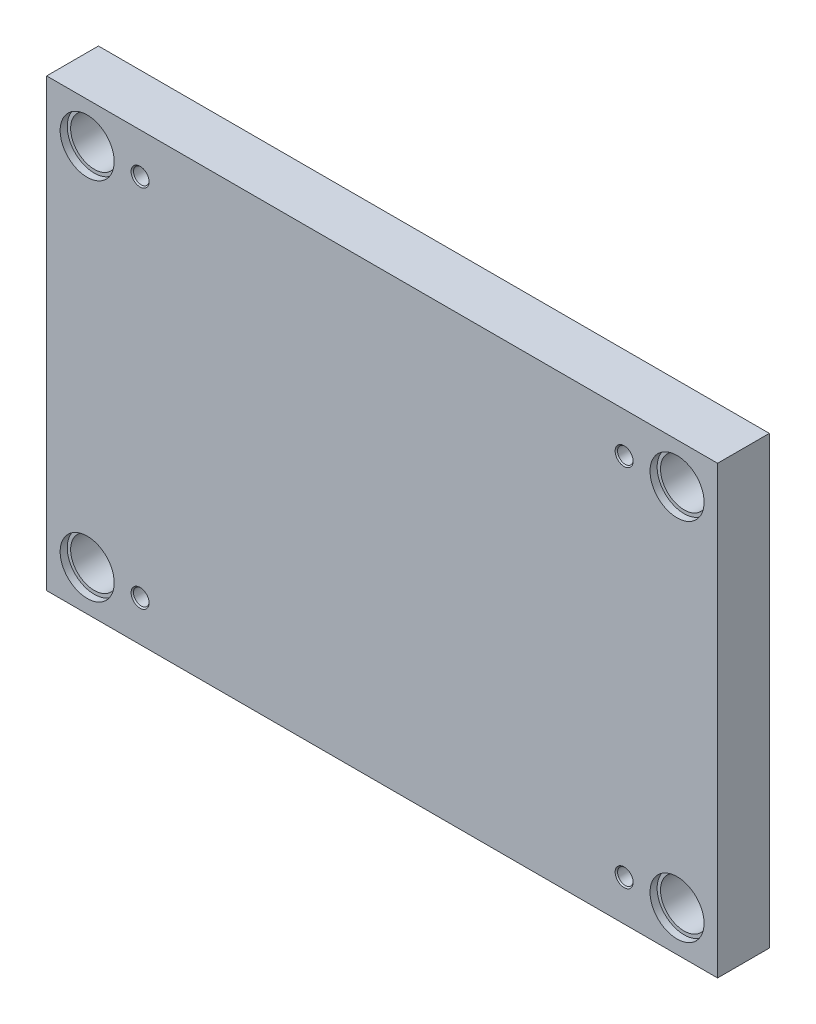
ISO-10303-21;
HEADER;
FILE_DESCRIPTION(('STEP AP214'),'2;1');
FILE_NAME('part.step','',(''),(''),'','','');
FILE_SCHEMA(('AUTOMOTIVE_DESIGN { 1 0 10303 214 1 1 1 1 }'));
ENDSEC;
DATA;
#1=APPLICATION_CONTEXT('core data for automotive mechanical design processes');
#2=APPLICATION_PROTOCOL_DEFINITION('international standard','automotive_design',2000,#1);
#3=PRODUCT_CONTEXT('',#1,'mechanical');
#4=PRODUCT('Part','Part','',(#3));
#5=PRODUCT_RELATED_PRODUCT_CATEGORY('part','',(#4));
#6=PRODUCT_DEFINITION_FORMATION('','',#4);
#7=PRODUCT_DEFINITION_CONTEXT('part definition',#1,'design');
#8=PRODUCT_DEFINITION('design','',#6,#7);
#9=PRODUCT_DEFINITION_SHAPE('','',#8);
#10=(LENGTH_UNIT() NAMED_UNIT(*) SI_UNIT(.MILLI.,.METRE.));
#11=(NAMED_UNIT(*) PLANE_ANGLE_UNIT() SI_UNIT($,.RADIAN.));
#12=(NAMED_UNIT(*) SI_UNIT($,.STERADIAN.) SOLID_ANGLE_UNIT());
#13=UNCERTAINTY_MEASURE_WITH_UNIT(LENGTH_MEASURE(1.E-05),#10,'distance_accuracy_value','');
#14=(GEOMETRIC_REPRESENTATION_CONTEXT(3) GLOBAL_UNCERTAINTY_ASSIGNED_CONTEXT((#13)) GLOBAL_UNIT_ASSIGNED_CONTEXT((#10,
#11,#12)) REPRESENTATION_CONTEXT('',''));
#15=CARTESIAN_POINT('',(0.,0.,0.));
#16=DIRECTION('',(0.,0.,1.));
#17=DIRECTION('',(1.,0.,0.));
#18=AXIS2_PLACEMENT_3D('',#15,#16,#17);
#19=CARTESIAN_POINT('',(0.,0.,46.));
#20=DIRECTION('',(0.,0.,1.));
#21=DIRECTION('',(1.,0.,0.));
#22=AXIS2_PLACEMENT_3D('',#19,#20,#21);
#23=PLANE('',#22);
#24=CARTESIAN_POINT('',(215.,162.,46.));
#25=DIRECTION('',(0.,0.,1.));
#26=DIRECTION('',(1.,0.,0.));
#27=AXIS2_PLACEMENT_3D('',#24,#25,#26);
#28=CIRCLE('',#27,8.00000000000001);
#29=CARTESIAN_POINT('',(223.,162.,46.));
#30=VERTEX_POINT('',#29);
#31=EDGE_CURVE('E125',#30,#30,#28,.T.);
#32=ORIENTED_EDGE('',*,*,#31,.F.);
#33=EDGE_LOOP('',(#32));
#34=FACE_BOUND('',#33,.T.);
#35=CARTESIAN_POINT('',(-215.,162.,46.));
#36=DIRECTION('',(0.,0.,1.));
#37=DIRECTION('',(1.,0.,0.));
#38=AXIS2_PLACEMENT_3D('',#35,#36,#37);
#39=CIRCLE('',#38,8.00000000000001);
#40=CARTESIAN_POINT('',(-207.,162.,46.));
#41=VERTEX_POINT('',#40);
#42=EDGE_CURVE('E143',#41,#41,#39,.T.);
#43=ORIENTED_EDGE('',*,*,#42,.F.);
#44=EDGE_LOOP('',(#43));
#45=FACE_BOUND('',#44,.T.);
#46=CARTESIAN_POINT('',(262.,-162.,46.));
#47=DIRECTION('',(0.,0.,1.));
#48=DIRECTION('',(1.,0.,0.));
#49=AXIS2_PLACEMENT_3D('',#46,#47,#48);
#50=CIRCLE('',#49,24.);
#51=CARTESIAN_POINT('',(286.,-162.,46.));
#52=VERTEX_POINT('',#51);
#53=EDGE_CURVE('E146',#52,#52,#50,.T.);
#54=ORIENTED_EDGE('',*,*,#53,.F.);
#55=EDGE_LOOP('',(#54));
#56=FACE_BOUND('',#55,.T.);
#57=CARTESIAN_POINT('',(-262.,-162.,46.));
#58=DIRECTION('',(0.,0.,1.));
#59=DIRECTION('',(1.,0.,0.));
#60=AXIS2_PLACEMENT_3D('',#57,#58,#59);
#61=CIRCLE('',#60,24.);
#62=CARTESIAN_POINT('',(-238.,-162.,46.));
#63=VERTEX_POINT('',#62);
#64=EDGE_CURVE('E156',#63,#63,#61,.T.);
#65=ORIENTED_EDGE('',*,*,#64,.F.);
#66=EDGE_LOOP('',(#65));
#67=FACE_BOUND('',#66,.T.);
#68=CARTESIAN_POINT('',(262.,162.,46.));
#69=DIRECTION('',(0.,0.,1.));
#70=DIRECTION('',(1.,0.,0.));
#71=AXIS2_PLACEMENT_3D('',#68,#69,#70);
#72=CIRCLE('',#71,24.);
#73=CARTESIAN_POINT('',(286.,162.,46.));
#74=VERTEX_POINT('',#73);
#75=EDGE_CURVE('E163',#74,#74,#72,.T.);
#76=ORIENTED_EDGE('',*,*,#75,.F.);
#77=EDGE_LOOP('',(#76));
#78=FACE_BOUND('',#77,.T.);
#79=CARTESIAN_POINT('',(-262.,162.,46.));
#80=DIRECTION('',(0.,0.,1.));
#81=DIRECTION('',(1.,0.,0.));
#82=AXIS2_PLACEMENT_3D('',#79,#80,#81);
#83=CIRCLE('',#82,24.);
#84=CARTESIAN_POINT('',(-238.,162.,46.));
#85=VERTEX_POINT('',#84);
#86=EDGE_CURVE('E170',#85,#85,#83,.T.);
#87=ORIENTED_EDGE('',*,*,#86,.F.);
#88=EDGE_LOOP('',(#87));
#89=FACE_BOUND('',#88,.T.);
#90=DIRECTION('',(0.,-1.,0.));
#91=VECTOR('',#90,1.);
#92=CARTESIAN_POINT('',(-298.,198.,46.));
#93=LINE('',#92,#91);
#94=CARTESIAN_POINT('',(-298.,198.,46.));
#95=VERTEX_POINT('',#94);
#96=CARTESIAN_POINT('',(-298.,-198.,46.));
#97=VERTEX_POINT('',#96);
#98=EDGE_CURVE('E186',#95,#97,#93,.T.);
#99=ORIENTED_EDGE('',*,*,#98,.T.);
#100=DIRECTION('',(1.,0.,0.));
#101=VECTOR('',#100,1.);
#102=CARTESIAN_POINT('',(-298.,-198.,46.));
#103=LINE('',#102,#101);
#104=CARTESIAN_POINT('',(298.,-198.,46.));
#105=VERTEX_POINT('',#104);
#106=EDGE_CURVE('E89',#97,#105,#103,.T.);
#107=ORIENTED_EDGE('',*,*,#106,.T.);
#108=DIRECTION('',(0.,1.,0.));
#109=VECTOR('',#108,1.);
#110=CARTESIAN_POINT('',(298.,-198.,46.));
#111=LINE('',#110,#109);
#112=CARTESIAN_POINT('',(298.,198.,46.));
#113=VERTEX_POINT('',#112);
#114=EDGE_CURVE('E189',#105,#113,#111,.T.);
#115=ORIENTED_EDGE('',*,*,#114,.T.);
#116=DIRECTION('',(-1.,0.,0.));
#117=VECTOR('',#116,1.);
#118=CARTESIAN_POINT('',(298.,198.,46.));
#119=LINE('',#118,#117);
#120=EDGE_CURVE('E58',#113,#95,#119,.T.);
#121=ORIENTED_EDGE('',*,*,#120,.T.);
#122=EDGE_LOOP('',(#99,#107,#115,#121));
#123=FACE_BOUND('',#122,.T.);
#124=CARTESIAN_POINT('',(-215.,-162.,46.));
#125=DIRECTION('',(0.,0.,-1.));
#126=DIRECTION('',(-1.,0.,0.));
#127=AXIS2_PLACEMENT_3D('',#124,#125,#126);
#128=CIRCLE('',#127,8.00000000000001);
#129=CARTESIAN_POINT('',(-223.,-162.,46.));
#130=VERTEX_POINT('',#129);
#131=EDGE_CURVE('E134',#130,#130,#128,.T.);
#132=ORIENTED_EDGE('',*,*,#131,.T.);
#133=EDGE_LOOP('',(#132));
#134=FACE_BOUND('',#133,.T.);
#135=CARTESIAN_POINT('',(215.,-162.,46.));
#136=DIRECTION('',(0.,0.,-1.));
#137=DIRECTION('',(-1.,0.,0.));
#138=AXIS2_PLACEMENT_3D('',#135,#136,#137);
#139=CIRCLE('',#138,8.00000000000001);
#140=CARTESIAN_POINT('',(207.,-162.,46.));
#141=VERTEX_POINT('',#140);
#142=EDGE_CURVE('E114',#141,#141,#139,.T.);
#143=ORIENTED_EDGE('',*,*,#142,.T.);
#144=EDGE_LOOP('',(#143));
#145=FACE_BOUND('',#144,.T.);
#146=ADVANCED_FACE('F39',(#34,#45,#56,#67,#78,#89,#123,#134,#145),#23,.T.);
#147=CARTESIAN_POINT('',(262.,-162.,0.));
#148=DIRECTION('',(0.,0.,1.));
#149=DIRECTION('',(1.,0.,0.));
#150=AXIS2_PLACEMENT_3D('',#147,#148,#149);
#151=CYLINDRICAL_SURFACE('',#150,21.);
#152=CARTESIAN_POINT('',(262.,-162.,0.));
#153=DIRECTION('',(0.,0.,1.));
#154=DIRECTION('',(1.,0.,0.));
#155=AXIS2_PLACEMENT_3D('',#152,#153,#154);
#156=CIRCLE('',#155,21.);
#157=CARTESIAN_POINT('',(283.,-162.,0.));
#158=VERTEX_POINT('',#157);
#159=EDGE_CURVE('E179',#158,#158,#156,.T.);
#160=ORIENTED_EDGE('',*,*,#159,.F.);
#161=EDGE_LOOP('',(#160));
#162=FACE_BOUND('',#161,.T.);
#163=CARTESIAN_POINT('',(262.,-162.,39.7));
#164=DIRECTION('',(0.,0.,1.));
#165=DIRECTION('',(1.,0.,0.));
#166=AXIS2_PLACEMENT_3D('',#163,#164,#165);
#167=CIRCLE('',#166,21.);
#168=CARTESIAN_POINT('',(283.,-162.,39.7));
#169=VERTEX_POINT('',#168);
#170=EDGE_CURVE('E43',#169,#169,#167,.F.);
#171=ORIENTED_EDGE('',*,*,#170,.F.);
#172=EDGE_LOOP('',(#171));
#173=FACE_BOUND('',#172,.T.);
#174=ADVANCED_FACE('F214',(#162,#173),#151,.F.);
#175=CARTESIAN_POINT('',(-262.,-162.,0.));
#176=DIRECTION('',(0.,0.,1.));
#177=DIRECTION('',(1.,0.,0.));
#178=AXIS2_PLACEMENT_3D('',#175,#176,#177);
#179=CYLINDRICAL_SURFACE('',#178,21.);
#180=CARTESIAN_POINT('',(-262.,-162.,0.));
#181=DIRECTION('',(0.,0.,1.));
#182=DIRECTION('',(1.,0.,0.));
#183=AXIS2_PLACEMENT_3D('',#180,#181,#182);
#184=CIRCLE('',#183,21.);
#185=CARTESIAN_POINT('',(-241.,-162.,0.));
#186=VERTEX_POINT('',#185);
#187=EDGE_CURVE('E176',#186,#186,#184,.T.);
#188=ORIENTED_EDGE('',*,*,#187,.F.);
#189=EDGE_LOOP('',(#188));
#190=FACE_BOUND('',#189,.T.);
#191=CARTESIAN_POINT('',(-262.,-162.,39.7));
#192=DIRECTION('',(0.,0.,1.));
#193=DIRECTION('',(1.,0.,0.));
#194=AXIS2_PLACEMENT_3D('',#191,#192,#193);
#195=CIRCLE('',#194,21.);
#196=CARTESIAN_POINT('',(-241.,-162.,39.7));
#197=VERTEX_POINT('',#196);
#198=EDGE_CURVE('E155',#197,#197,#195,.F.);
#199=ORIENTED_EDGE('',*,*,#198,.F.);
#200=EDGE_LOOP('',(#199));
#201=FACE_BOUND('',#200,.T.);
#202=ADVANCED_FACE('F211',(#190,#201),#179,.F.);
#203=CARTESIAN_POINT('',(262.,162.,0.));
#204=DIRECTION('',(0.,0.,1.));
#205=DIRECTION('',(1.,0.,0.));
#206=AXIS2_PLACEMENT_3D('',#203,#204,#205);
#207=CYLINDRICAL_SURFACE('',#206,21.);
#208=CARTESIAN_POINT('',(262.,162.,0.));
#209=DIRECTION('',(0.,0.,1.));
#210=DIRECTION('',(1.,0.,0.));
#211=AXIS2_PLACEMENT_3D('',#208,#209,#210);
#212=CIRCLE('',#211,21.);
#213=CARTESIAN_POINT('',(283.,162.,0.));
#214=VERTEX_POINT('',#213);
#215=EDGE_CURVE('E182',#214,#214,#212,.T.);
#216=ORIENTED_EDGE('',*,*,#215,.F.);
#217=EDGE_LOOP('',(#216));
#218=FACE_BOUND('',#217,.T.);
#219=CARTESIAN_POINT('',(262.,162.,39.7));
#220=DIRECTION('',(0.,0.,1.));
#221=DIRECTION('',(1.,0.,0.));
#222=AXIS2_PLACEMENT_3D('',#219,#220,#221);
#223=CIRCLE('',#222,21.);
#224=CARTESIAN_POINT('',(283.,162.,39.7));
#225=VERTEX_POINT('',#224);
#226=EDGE_CURVE('E162',#225,#225,#223,.F.);
#227=ORIENTED_EDGE('',*,*,#226,.F.);
#228=EDGE_LOOP('',(#227));
#229=FACE_BOUND('',#228,.T.);
#230=ADVANCED_FACE('F213',(#218,#229),#207,.F.);
#231=CARTESIAN_POINT('',(-262.,162.,0.));
#232=DIRECTION('',(0.,0.,1.));
#233=DIRECTION('',(1.,0.,0.));
#234=AXIS2_PLACEMENT_3D('',#231,#232,#233);
#235=CYLINDRICAL_SURFACE('',#234,21.);
#236=CARTESIAN_POINT('',(-262.,162.,0.));
#237=DIRECTION('',(0.,0.,1.));
#238=DIRECTION('',(1.,0.,0.));
#239=AXIS2_PLACEMENT_3D('',#236,#237,#238);
#240=CIRCLE('',#239,21.);
#241=CARTESIAN_POINT('',(-241.,162.,0.));
#242=VERTEX_POINT('',#241);
#243=EDGE_CURVE('E173',#242,#242,#240,.T.);
#244=ORIENTED_EDGE('',*,*,#243,.F.);
#245=EDGE_LOOP('',(#244));
#246=FACE_BOUND('',#245,.T.);
#247=CARTESIAN_POINT('',(-262.,162.,39.7));
#248=DIRECTION('',(0.,0.,1.));
#249=DIRECTION('',(1.,0.,0.));
#250=AXIS2_PLACEMENT_3D('',#247,#248,#249);
#251=CIRCLE('',#250,21.);
#252=CARTESIAN_POINT('',(-241.,162.,39.7));
#253=VERTEX_POINT('',#252);
#254=EDGE_CURVE('E169',#253,#253,#251,.F.);
#255=ORIENTED_EDGE('',*,*,#254,.F.);
#256=EDGE_LOOP('',(#255));
#257=FACE_BOUND('',#256,.T.);
#258=ADVANCED_FACE('F221',(#246,#257),#235,.F.);
#259=CARTESIAN_POINT('',(-298.,198.,46.));
#260=DIRECTION('',(1.,0.,0.));
#261=DIRECTION('',(0.,0.,-1.));
#262=AXIS2_PLACEMENT_3D('',#259,#260,#261);
#263=PLANE('',#262);
#264=DIRECTION('',(0.,-1.,0.));
#265=VECTOR('',#264,1.);
#266=CARTESIAN_POINT('',(-298.,198.,0.));
#267=LINE('',#266,#265);
#268=CARTESIAN_POINT('',(-298.,198.,0.));
#269=VERTEX_POINT('',#268);
#270=CARTESIAN_POINT('',(-298.,-198.,0.));
#271=VERTEX_POINT('',#270);
#272=EDGE_CURVE('E185',#269,#271,#267,.T.);
#273=ORIENTED_EDGE('',*,*,#272,.T.);
#274=DIRECTION('',(0.,0.,-1.));
#275=VECTOR('',#274,1.);
#276=CARTESIAN_POINT('',(-298.,-198.,46.));
#277=LINE('',#276,#275);
#278=EDGE_CURVE('E11',#97,#271,#277,.T.);
#279=ORIENTED_EDGE('',*,*,#278,.F.);
#280=ORIENTED_EDGE('',*,*,#98,.F.);
#281=DIRECTION('',(0.,0.,-1.));
#282=VECTOR('',#281,1.);
#283=CARTESIAN_POINT('',(-298.,198.,46.));
#284=LINE('',#283,#282);
#285=EDGE_CURVE('E192',#95,#269,#284,.T.);
#286=ORIENTED_EDGE('',*,*,#285,.T.);
#287=EDGE_LOOP('',(#273,#279,#280,#286));
#288=FACE_BOUND('',#287,.T.);
#289=ADVANCED_FACE('F41',(#288),#263,.F.);
#290=CARTESIAN_POINT('',(-298.,-198.,46.));
#291=DIRECTION('',(0.,1.,0.));
#292=DIRECTION('',(0.,0.,1.));
#293=AXIS2_PLACEMENT_3D('',#290,#291,#292);
#294=PLANE('',#293);
#295=DIRECTION('',(1.,0.,0.));
#296=VECTOR('',#295,1.);
#297=CARTESIAN_POINT('',(-298.,-198.,0.));
#298=LINE('',#297,#296);
#299=CARTESIAN_POINT('',(298.,-198.,0.));
#300=VERTEX_POINT('',#299);
#301=EDGE_CURVE('E195',#271,#300,#298,.T.);
#302=ORIENTED_EDGE('',*,*,#301,.T.);
#303=DIRECTION('',(0.,0.,-1.));
#304=VECTOR('',#303,1.);
#305=CARTESIAN_POINT('',(298.,-198.,46.));
#306=LINE('',#305,#304);
#307=EDGE_CURVE('E49',#105,#300,#306,.T.);
#308=ORIENTED_EDGE('',*,*,#307,.F.);
#309=ORIENTED_EDGE('',*,*,#106,.F.);
#310=ORIENTED_EDGE('',*,*,#278,.T.);
#311=EDGE_LOOP('',(#302,#308,#309,#310));
#312=FACE_BOUND('',#311,.T.);
#313=ADVANCED_FACE('F246',(#312),#294,.F.);
#314=CARTESIAN_POINT('',(298.,-198.,46.));
#315=DIRECTION('',(-1.,0.,0.));
#316=DIRECTION('',(0.,0.,1.));
#317=AXIS2_PLACEMENT_3D('',#314,#315,#316);
#318=PLANE('',#317);
#319=DIRECTION('',(0.,1.,0.));
#320=VECTOR('',#319,1.);
#321=CARTESIAN_POINT('',(298.,-198.,0.));
#322=LINE('',#321,#320);
#323=CARTESIAN_POINT('',(298.,198.,0.));
#324=VERTEX_POINT('',#323);
#325=EDGE_CURVE('E76',#300,#324,#322,.T.);
#326=ORIENTED_EDGE('',*,*,#325,.T.);
#327=DIRECTION('',(0.,0.,-1.));
#328=VECTOR('',#327,1.);
#329=CARTESIAN_POINT('',(298.,198.,46.));
#330=LINE('',#329,#328);
#331=EDGE_CURVE('E200',#113,#324,#330,.T.);
#332=ORIENTED_EDGE('',*,*,#331,.F.);
#333=ORIENTED_EDGE('',*,*,#114,.F.);
#334=ORIENTED_EDGE('',*,*,#307,.T.);
#335=EDGE_LOOP('',(#326,#332,#333,#334));
#336=FACE_BOUND('',#335,.T.);
#337=ADVANCED_FACE('F244',(#336),#318,.F.);
#338=CARTESIAN_POINT('',(298.,198.,46.));
#339=DIRECTION('',(0.,-1.,0.));
#340=DIRECTION('',(0.,0.,-1.));
#341=AXIS2_PLACEMENT_3D('',#338,#339,#340);
#342=PLANE('',#341);
#343=DIRECTION('',(-1.,0.,0.));
#344=VECTOR('',#343,1.);
#345=CARTESIAN_POINT('',(298.,198.,0.));
#346=LINE('',#345,#344);
#347=EDGE_CURVE('E82',#324,#269,#346,.T.);
#348=ORIENTED_EDGE('',*,*,#347,.T.);
#349=ORIENTED_EDGE('',*,*,#285,.F.);
#350=ORIENTED_EDGE('',*,*,#120,.F.);
#351=ORIENTED_EDGE('',*,*,#331,.T.);
#352=EDGE_LOOP('',(#348,#349,#350,#351));
#353=FACE_BOUND('',#352,.T.);
#354=ADVANCED_FACE('F240',(#353),#342,.F.);
#355=CARTESIAN_POINT('',(0.,0.,0.));
#356=DIRECTION('',(0.,0.,1.));
#357=DIRECTION('',(1.,0.,0.));
#358=AXIS2_PLACEMENT_3D('',#355,#356,#357);
#359=PLANE('',#358);
#360=ORIENTED_EDGE('',*,*,#243,.T.);
#361=EDGE_LOOP('',(#360));
#362=FACE_BOUND('',#361,.T.);
#363=ORIENTED_EDGE('',*,*,#187,.T.);
#364=EDGE_LOOP('',(#363));
#365=FACE_BOUND('',#364,.T.);
#366=ORIENTED_EDGE('',*,*,#159,.T.);
#367=EDGE_LOOP('',(#366));
#368=FACE_BOUND('',#367,.T.);
#369=ORIENTED_EDGE('',*,*,#215,.T.);
#370=EDGE_LOOP('',(#369));
#371=FACE_BOUND('',#370,.T.);
#372=ORIENTED_EDGE('',*,*,#272,.F.);
#373=ORIENTED_EDGE('',*,*,#347,.F.);
#374=ORIENTED_EDGE('',*,*,#325,.F.);
#375=ORIENTED_EDGE('',*,*,#301,.F.);
#376=EDGE_LOOP('',(#372,#373,#374,#375));
#377=FACE_BOUND('',#376,.T.);
#378=ADVANCED_FACE('F236',(#362,#365,#368,#371,#377),#359,.F.);
#379=CARTESIAN_POINT('',(-262.,162.,39.7));
#380=DIRECTION('',(0.,0.,1.));
#381=DIRECTION('',(1.,0.,0.));
#382=AXIS2_PLACEMENT_3D('',#379,#380,#381);
#383=PLANE('',#382);
#384=CARTESIAN_POINT('',(-262.,162.,39.7));
#385=DIRECTION('',(0.,0.,1.));
#386=DIRECTION('',(1.,0.,0.));
#387=AXIS2_PLACEMENT_3D('',#384,#385,#386);
#388=CIRCLE('',#387,24.);
#389=CARTESIAN_POINT('',(-238.,162.,39.7));
#390=VERTEX_POINT('',#389);
#391=EDGE_CURVE('E166',#390,#390,#388,.T.);
#392=ORIENTED_EDGE('',*,*,#391,.T.);
#393=EDGE_LOOP('',(#392));
#394=FACE_BOUND('',#393,.T.);
#395=ORIENTED_EDGE('',*,*,#254,.T.);
#396=EDGE_LOOP('',(#395));
#397=FACE_BOUND('',#396,.T.);
#398=ADVANCED_FACE('F239',(#394,#397),#383,.T.);
#399=CARTESIAN_POINT('',(-262.,162.,39.7));
#400=DIRECTION('',(0.,0.,1.));
#401=DIRECTION('',(1.,0.,0.));
#402=AXIS2_PLACEMENT_3D('',#399,#400,#401);
#403=CYLINDRICAL_SURFACE('',#402,24.);
#404=ORIENTED_EDGE('',*,*,#391,.F.);
#405=EDGE_LOOP('',(#404));
#406=FACE_BOUND('',#405,.T.);
#407=ORIENTED_EDGE('',*,*,#86,.T.);
#408=EDGE_LOOP('',(#407));
#409=FACE_BOUND('',#408,.T.);
#410=ADVANCED_FACE('F326',(#406,#409),#403,.F.);
#411=CARTESIAN_POINT('',(262.,162.,39.7));
#412=DIRECTION('',(0.,0.,1.));
#413=DIRECTION('',(1.,0.,0.));
#414=AXIS2_PLACEMENT_3D('',#411,#412,#413);
#415=PLANE('',#414);
#416=CARTESIAN_POINT('',(262.,162.,39.7));
#417=DIRECTION('',(0.,0.,1.));
#418=DIRECTION('',(1.,0.,0.));
#419=AXIS2_PLACEMENT_3D('',#416,#417,#418);
#420=CIRCLE('',#419,24.);
#421=CARTESIAN_POINT('',(286.,162.,39.7));
#422=VERTEX_POINT('',#421);
#423=EDGE_CURVE('E159',#422,#422,#420,.T.);
#424=ORIENTED_EDGE('',*,*,#423,.T.);
#425=EDGE_LOOP('',(#424));
#426=FACE_BOUND('',#425,.T.);
#427=ORIENTED_EDGE('',*,*,#226,.T.);
#428=EDGE_LOOP('',(#427));
#429=FACE_BOUND('',#428,.T.);
#430=ADVANCED_FACE('F323',(#426,#429),#415,.T.);
#431=CARTESIAN_POINT('',(262.,162.,39.7));
#432=DIRECTION('',(0.,0.,1.));
#433=DIRECTION('',(1.,0.,0.));
#434=AXIS2_PLACEMENT_3D('',#431,#432,#433);
#435=CYLINDRICAL_SURFACE('',#434,24.);
#436=ORIENTED_EDGE('',*,*,#423,.F.);
#437=EDGE_LOOP('',(#436));
#438=FACE_BOUND('',#437,.T.);
#439=ORIENTED_EDGE('',*,*,#75,.T.);
#440=EDGE_LOOP('',(#439));
#441=FACE_BOUND('',#440,.T.);
#442=ADVANCED_FACE('F318',(#438,#441),#435,.F.);
#443=CARTESIAN_POINT('',(-262.,-162.,39.7));
#444=DIRECTION('',(0.,0.,1.));
#445=DIRECTION('',(1.,0.,0.));
#446=AXIS2_PLACEMENT_3D('',#443,#444,#445);
#447=PLANE('',#446);
#448=CARTESIAN_POINT('',(-262.,-162.,39.7));
#449=DIRECTION('',(0.,0.,1.));
#450=DIRECTION('',(1.,0.,0.));
#451=AXIS2_PLACEMENT_3D('',#448,#449,#450);
#452=CIRCLE('',#451,24.);
#453=CARTESIAN_POINT('',(-238.,-162.,39.7));
#454=VERTEX_POINT('',#453);
#455=EDGE_CURVE('E152',#454,#454,#452,.T.);
#456=ORIENTED_EDGE('',*,*,#455,.T.);
#457=EDGE_LOOP('',(#456));
#458=FACE_BOUND('',#457,.T.);
#459=ORIENTED_EDGE('',*,*,#198,.T.);
#460=EDGE_LOOP('',(#459));
#461=FACE_BOUND('',#460,.T.);
#462=ADVANCED_FACE('F209',(#458,#461),#447,.T.);
#463=CARTESIAN_POINT('',(-262.,-162.,39.7));
#464=DIRECTION('',(0.,0.,1.));
#465=DIRECTION('',(1.,0.,0.));
#466=AXIS2_PLACEMENT_3D('',#463,#464,#465);
#467=CYLINDRICAL_SURFACE('',#466,24.);
#468=ORIENTED_EDGE('',*,*,#455,.F.);
#469=EDGE_LOOP('',(#468));
#470=FACE_BOUND('',#469,.T.);
#471=ORIENTED_EDGE('',*,*,#64,.T.);
#472=EDGE_LOOP('',(#471));
#473=FACE_BOUND('',#472,.T.);
#474=ADVANCED_FACE('F311',(#470,#473),#467,.F.);
#475=CARTESIAN_POINT('',(262.,-162.,39.7));
#476=DIRECTION('',(0.,0.,1.));
#477=DIRECTION('',(1.,0.,0.));
#478=AXIS2_PLACEMENT_3D('',#475,#476,#477);
#479=PLANE('',#478);
#480=CARTESIAN_POINT('',(262.,-162.,39.7));
#481=DIRECTION('',(0.,0.,1.));
#482=DIRECTION('',(1.,0.,0.));
#483=AXIS2_PLACEMENT_3D('',#480,#481,#482);
#484=CIRCLE('',#483,24.);
#485=CARTESIAN_POINT('',(286.,-162.,39.7));
#486=VERTEX_POINT('',#485);
#487=EDGE_CURVE('E147',#486,#486,#484,.T.);
#488=ORIENTED_EDGE('',*,*,#487,.T.);
#489=EDGE_LOOP('',(#488));
#490=FACE_BOUND('',#489,.T.);
#491=ORIENTED_EDGE('',*,*,#170,.T.);
#492=EDGE_LOOP('',(#491));
#493=FACE_BOUND('',#492,.T.);
#494=ADVANCED_FACE('F308',(#490,#493),#479,.T.);
#495=CARTESIAN_POINT('',(262.,-162.,39.7));
#496=DIRECTION('',(0.,0.,1.));
#497=DIRECTION('',(1.,0.,0.));
#498=AXIS2_PLACEMENT_3D('',#495,#496,#497);
#499=CYLINDRICAL_SURFACE('',#498,24.);
#500=ORIENTED_EDGE('',*,*,#487,.F.);
#501=EDGE_LOOP('',(#500));
#502=FACE_BOUND('',#501,.T.);
#503=ORIENTED_EDGE('',*,*,#53,.T.);
#504=EDGE_LOOP('',(#503));
#505=FACE_BOUND('',#504,.T.);
#506=ADVANCED_FACE('F306',(#502,#505),#499,.F.);
#507=CARTESIAN_POINT('',(-215.,162.,44.9175));
#508=DIRECTION('',(0.,0.,1.));
#509=DIRECTION('',(1.,0.,0.));
#510=AXIS2_PLACEMENT_3D('',#507,#508,#509);
#511=CONICAL_SURFACE('',#510,6.91749999999999,0.785398163397451);
#512=ORIENTED_EDGE('',*,*,#42,.T.);
#513=EDGE_LOOP('',(#512));
#514=FACE_BOUND('',#513,.T.);
#515=CARTESIAN_POINT('',(-215.,162.,44.9175));
#516=DIRECTION('',(0.,0.,1.));
#517=DIRECTION('',(1.,0.,0.));
#518=AXIS2_PLACEMENT_3D('',#515,#516,#517);
#519=CIRCLE('',#518,6.91749999999999);
#520=CARTESIAN_POINT('',(-208.0825,162.,44.9175));
#521=VERTEX_POINT('',#520);
#522=EDGE_CURVE('E140',#521,#521,#519,.T.);
#523=ORIENTED_EDGE('',*,*,#522,.F.);
#524=EDGE_LOOP('',(#523));
#525=FACE_BOUND('',#524,.T.);
#526=ADVANCED_FACE('F302',(#514,#525),#511,.F.);
#527=CARTESIAN_POINT('',(-215.,162.,2.00617951288078));
#528=DIRECTION('',(0.,0.,1.));
#529=DIRECTION('',(1.,0.,0.));
#530=AXIS2_PLACEMENT_3D('',#527,#528,#529);
#531=CYLINDRICAL_SURFACE('',#530,6.91749999999999);
#532=ORIENTED_EDGE('',*,*,#522,.T.);
#533=EDGE_LOOP('',(#532));
#534=FACE_BOUND('',#533,.T.);
#535=CARTESIAN_POINT('',(-215.,162.,6.));
#536=DIRECTION('',(0.,0.,1.));
#537=DIRECTION('',(1.,0.,0.));
#538=AXIS2_PLACEMENT_3D('',#535,#536,#537);
#539=CIRCLE('',#538,6.91749999999999);
#540=CARTESIAN_POINT('',(-208.0825,162.,6.));
#541=VERTEX_POINT('',#540);
#542=EDGE_CURVE('E137',#541,#541,#539,.T.);
#543=ORIENTED_EDGE('',*,*,#542,.F.);
#544=EDGE_LOOP('',(#543));
#545=FACE_BOUND('',#544,.T.);
#546=ADVANCED_FACE('F298',(#534,#545),#531,.F.);
#547=CARTESIAN_POINT('',(-215.,162.,2.00617951288078));
#548=DIRECTION('',(0.,0.,1.));
#549=DIRECTION('',(1.,0.,0.));
#550=AXIS2_PLACEMENT_3D('',#547,#548,#549);
#551=CONICAL_SURFACE('',#550,0.,1.0471975511966);
#552=ORIENTED_EDGE('',*,*,#542,.T.);
#553=EDGE_LOOP('',(#552));
#554=FACE_BOUND('',#553,.T.);
#555=CARTESIAN_POINT('',(-215.,162.,2.00617951288078));
#556=VERTEX_POINT('',#555);
#557=VERTEX_LOOP('',#556);
#558=FACE_BOUND('',#557,.T.);
#559=ADVANCED_FACE('F294',(#554,#558),#551,.F.);
#560=CARTESIAN_POINT('',(-215.,-162.,46.));
#561=DIRECTION('',(0.,0.,1.));
#562=DIRECTION('',(1.,0.,0.));
#563=AXIS2_PLACEMENT_3D('',#560,#561,#562);
#564=CONICAL_SURFACE('',#563,8.00000000000001,0.785398163397451);
#565=CARTESIAN_POINT('',(-215.,-162.,44.9175));
#566=DIRECTION('',(0.,0.,-1.));
#567=DIRECTION('',(-1.,0.,0.));
#568=AXIS2_PLACEMENT_3D('',#565,#566,#567);
#569=CIRCLE('',#568,6.91749999999999);
#570=CARTESIAN_POINT('',(-221.9175,-162.,44.9175));
#571=VERTEX_POINT('',#570);
#572=EDGE_CURVE('E131',#571,#571,#569,.T.);
#573=ORIENTED_EDGE('',*,*,#572,.T.);
#574=EDGE_LOOP('',(#573));
#575=FACE_BOUND('',#574,.T.);
#576=ORIENTED_EDGE('',*,*,#131,.F.);
#577=EDGE_LOOP('',(#576));
#578=FACE_BOUND('',#577,.T.);
#579=ADVANCED_FACE('F290',(#575,#578),#564,.F.);
#580=CARTESIAN_POINT('',(-215.,-162.,46.));
#581=DIRECTION('',(0.,0.,-1.));
#582=DIRECTION('',(-1.,0.,0.));
#583=AXIS2_PLACEMENT_3D('',#580,#581,#582);
#584=CYLINDRICAL_SURFACE('',#583,6.91749999999999);
#585=CARTESIAN_POINT('',(-215.,-162.,6.));
#586=DIRECTION('',(0.,0.,-1.));
#587=DIRECTION('',(-1.,0.,0.));
#588=AXIS2_PLACEMENT_3D('',#585,#586,#587);
#589=CIRCLE('',#588,6.91749999999999);
#590=CARTESIAN_POINT('',(-221.9175,-162.,6.));
#591=VERTEX_POINT('',#590);
#592=EDGE_CURVE('E128',#591,#591,#589,.T.);
#593=ORIENTED_EDGE('',*,*,#592,.T.);
#594=EDGE_LOOP('',(#593));
#595=FACE_BOUND('',#594,.T.);
#596=ORIENTED_EDGE('',*,*,#572,.F.);
#597=EDGE_LOOP('',(#596));
#598=FACE_BOUND('',#597,.T.);
#599=ADVANCED_FACE('F286',(#595,#598),#584,.F.);
#600=CARTESIAN_POINT('',(-215.,-162.,6.));
#601=DIRECTION('',(0.,0.,1.));
#602=DIRECTION('',(1.,0.,0.));
#603=AXIS2_PLACEMENT_3D('',#600,#601,#602);
#604=CONICAL_SURFACE('',#603,6.91749999999999,1.0471975511966);
#605=CARTESIAN_POINT('',(-215.,-162.,2.00617951288079));
#606=VERTEX_POINT('',#605);
#607=VERTEX_LOOP('',#606);
#608=FACE_BOUND('',#607,.T.);
#609=ORIENTED_EDGE('',*,*,#592,.F.);
#610=EDGE_LOOP('',(#609));
#611=FACE_BOUND('',#610,.T.);
#612=ADVANCED_FACE('F282',(#608,#611),#604,.F.);
#613=CARTESIAN_POINT('',(215.,162.,44.9175));
#614=DIRECTION('',(0.,0.,1.));
#615=DIRECTION('',(1.,0.,0.));
#616=AXIS2_PLACEMENT_3D('',#613,#614,#615);
#617=CONICAL_SURFACE('',#616,6.91749999999999,0.785398163397451);
#618=ORIENTED_EDGE('',*,*,#31,.T.);
#619=EDGE_LOOP('',(#618));
#620=FACE_BOUND('',#619,.T.);
#621=CARTESIAN_POINT('',(215.,162.,44.9175));
#622=DIRECTION('',(0.,0.,1.));
#623=DIRECTION('',(1.,0.,0.));
#624=AXIS2_PLACEMENT_3D('',#621,#622,#623);
#625=CIRCLE('',#624,6.91749999999999);
#626=CARTESIAN_POINT('',(221.9175,162.,44.9175));
#627=VERTEX_POINT('',#626);
#628=EDGE_CURVE('E122',#627,#627,#625,.T.);
#629=ORIENTED_EDGE('',*,*,#628,.F.);
#630=EDGE_LOOP('',(#629));
#631=FACE_BOUND('',#630,.T.);
#632=ADVANCED_FACE('F278',(#620,#631),#617,.F.);
#633=CARTESIAN_POINT('',(215.,162.,2.00617951288078));
#634=DIRECTION('',(0.,0.,1.));
#635=DIRECTION('',(1.,0.,0.));
#636=AXIS2_PLACEMENT_3D('',#633,#634,#635);
#637=CYLINDRICAL_SURFACE('',#636,6.91749999999999);
#638=ORIENTED_EDGE('',*,*,#628,.T.);
#639=EDGE_LOOP('',(#638));
#640=FACE_BOUND('',#639,.T.);
#641=CARTESIAN_POINT('',(215.,162.,6.));
#642=DIRECTION('',(0.,0.,1.));
#643=DIRECTION('',(1.,0.,0.));
#644=AXIS2_PLACEMENT_3D('',#641,#642,#643);
#645=CIRCLE('',#644,6.91749999999999);
#646=CARTESIAN_POINT('',(221.9175,162.,6.));
#647=VERTEX_POINT('',#646);
#648=EDGE_CURVE('E119',#647,#647,#645,.T.);
#649=ORIENTED_EDGE('',*,*,#648,.F.);
#650=EDGE_LOOP('',(#649));
#651=FACE_BOUND('',#650,.T.);
#652=ADVANCED_FACE('F272',(#640,#651),#637,.F.);
#653=CARTESIAN_POINT('',(215.,162.,2.00617951288078));
#654=DIRECTION('',(0.,0.,1.));
#655=DIRECTION('',(1.,0.,0.));
#656=AXIS2_PLACEMENT_3D('',#653,#654,#655);
#657=CONICAL_SURFACE('',#656,0.,1.0471975511966);
#658=ORIENTED_EDGE('',*,*,#648,.T.);
#659=EDGE_LOOP('',(#658));
#660=FACE_BOUND('',#659,.T.);
#661=CARTESIAN_POINT('',(215.,162.,2.00617951288078));
#662=VERTEX_POINT('',#661);
#663=VERTEX_LOOP('',#662);
#664=FACE_BOUND('',#663,.T.);
#665=ADVANCED_FACE('F264',(#660,#664),#657,.F.);
#666=CARTESIAN_POINT('',(215.,-162.,46.));
#667=DIRECTION('',(0.,0.,1.));
#668=DIRECTION('',(1.,0.,0.));
#669=AXIS2_PLACEMENT_3D('',#666,#667,#668);
#670=CONICAL_SURFACE('',#669,8.00000000000001,0.785398163397451);
#671=CARTESIAN_POINT('',(215.,-162.,44.9175));
#672=DIRECTION('',(0.,0.,-1.));
#673=DIRECTION('',(-1.,0.,0.));
#674=AXIS2_PLACEMENT_3D('',#671,#672,#673);
#675=CIRCLE('',#674,6.91749999999999);
#676=CARTESIAN_POINT('',(208.0825,-162.,44.9175));
#677=VERTEX_POINT('',#676);
#678=EDGE_CURVE('E111',#677,#677,#675,.T.);
#679=ORIENTED_EDGE('',*,*,#678,.T.);
#680=EDGE_LOOP('',(#679));
#681=FACE_BOUND('',#680,.T.);
#682=ORIENTED_EDGE('',*,*,#142,.F.);
#683=EDGE_LOOP('',(#682));
#684=FACE_BOUND('',#683,.T.);
#685=ADVANCED_FACE('F262',(#681,#684),#670,.F.);
#686=CARTESIAN_POINT('',(215.,-162.,46.));
#687=DIRECTION('',(0.,0.,-1.));
#688=DIRECTION('',(-1.,0.,0.));
#689=AXIS2_PLACEMENT_3D('',#686,#687,#688);
#690=CYLINDRICAL_SURFACE('',#689,6.91749999999999);
#691=CARTESIAN_POINT('',(215.,-162.,6.));
#692=DIRECTION('',(0.,0.,-1.));
#693=DIRECTION('',(-1.,0.,0.));
#694=AXIS2_PLACEMENT_3D('',#691,#692,#693);
#695=CIRCLE('',#694,6.91749999999999);
#696=CARTESIAN_POINT('',(208.0825,-162.,6.));
#697=VERTEX_POINT('',#696);
#698=EDGE_CURVE('E109',#697,#697,#695,.T.);
#699=ORIENTED_EDGE('',*,*,#698,.T.);
#700=EDGE_LOOP('',(#699));
#701=FACE_BOUND('',#700,.T.);
#702=ORIENTED_EDGE('',*,*,#678,.F.);
#703=EDGE_LOOP('',(#702));
#704=FACE_BOUND('',#703,.T.);
#705=ADVANCED_FACE('F105',(#701,#704),#690,.F.);
#706=CARTESIAN_POINT('',(215.,-162.,6.));
#707=DIRECTION('',(0.,0.,1.));
#708=DIRECTION('',(1.,0.,0.));
#709=AXIS2_PLACEMENT_3D('',#706,#707,#708);
#710=CONICAL_SURFACE('',#709,6.91749999999999,1.0471975511966);
#711=CARTESIAN_POINT('',(215.,-162.,2.00617951288079));
#712=VERTEX_POINT('',#711);
#713=VERTEX_LOOP('',#712);
#714=FACE_BOUND('',#713,.T.);
#715=ORIENTED_EDGE('',*,*,#698,.F.);
#716=EDGE_LOOP('',(#715));
#717=FACE_BOUND('',#716,.T.);
#718=ADVANCED_FACE('F102',(#714,#717),#710,.F.);
#719=CLOSED_SHELL('',(#146,#174,#202,#230,#258,#289,#313,#337,#354,#378,#398,#410,#430,#442,
#462,#474,#494,#506,#526,#546,#559,#579,#599,#612,#632,#652,#665,#685,#705,#718));
#720=MANIFOLD_SOLID_BREP('B2',#719);
#721=ADVANCED_BREP_SHAPE_REPRESENTATION('',(#18,#720),#14);
#722=SHAPE_DEFINITION_REPRESENTATION(#9,#721);
ENDSEC;
END-ISO-10303-21;
